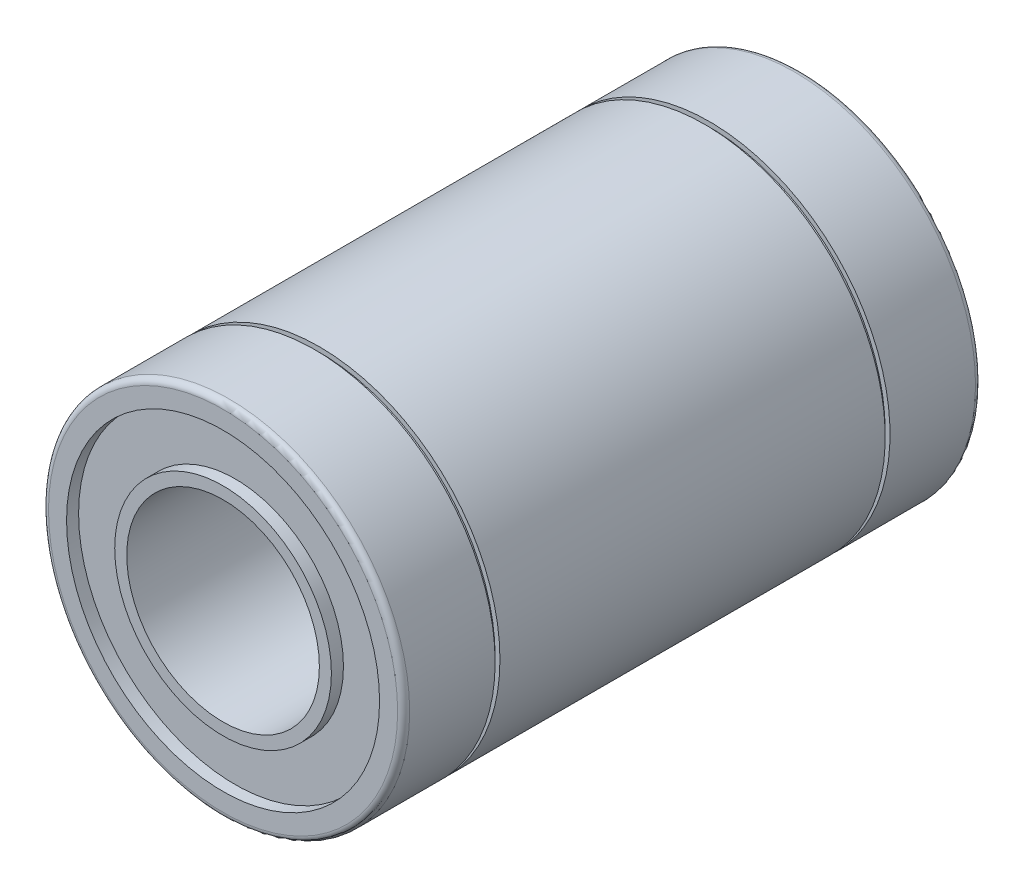
ISO-10303-21;
HEADER;
FILE_DESCRIPTION(('STEP AP214'),'2;1');
FILE_NAME('part.step','',(''),(''),'','','');
FILE_SCHEMA(('AUTOMOTIVE_DESIGN { 1 0 10303 214 1 1 1 1 }'));
ENDSEC;
DATA;
#1=APPLICATION_CONTEXT('core data for automotive mechanical design processes');
#2=APPLICATION_PROTOCOL_DEFINITION('international standard','automotive_design',2000,#1);
#3=PRODUCT_CONTEXT('',#1,'mechanical');
#4=PRODUCT('Part','Part','',(#3));
#5=PRODUCT_RELATED_PRODUCT_CATEGORY('part','',(#4));
#6=PRODUCT_DEFINITION_FORMATION('','',#4);
#7=PRODUCT_DEFINITION_CONTEXT('part definition',#1,'design');
#8=PRODUCT_DEFINITION('design','',#6,#7);
#9=PRODUCT_DEFINITION_SHAPE('','',#8);
#10=(LENGTH_UNIT() NAMED_UNIT(*) SI_UNIT(.MILLI.,.METRE.));
#11=(NAMED_UNIT(*) PLANE_ANGLE_UNIT() SI_UNIT($,.RADIAN.));
#12=(NAMED_UNIT(*) SI_UNIT($,.STERADIAN.) SOLID_ANGLE_UNIT());
#13=UNCERTAINTY_MEASURE_WITH_UNIT(LENGTH_MEASURE(1.E-05),#10,'distance_accuracy_value','');
#14=(GEOMETRIC_REPRESENTATION_CONTEXT(3) GLOBAL_UNCERTAINTY_ASSIGNED_CONTEXT((#13)) GLOBAL_UNIT_ASSIGNED_CONTEXT((#10,
#11,#12)) REPRESENTATION_CONTEXT('',''));
#15=CARTESIAN_POINT('',(0.,0.,0.));
#16=DIRECTION('',(0.,0.,1.));
#17=DIRECTION('',(1.,0.,0.));
#18=AXIS2_PLACEMENT_3D('',#15,#16,#17);
#19=CARTESIAN_POINT('',(0.,0.,12.));
#20=DIRECTION('',(0.,0.,-1.));
#21=DIRECTION('',(-1.,0.,0.));
#22=AXIS2_PLACEMENT_3D('',#19,#20,#21);
#23=CYLINDRICAL_SURFACE('',#22,7.5);
#24=CARTESIAN_POINT('',(0.,0.,8.));
#25=DIRECTION('',(0.,0.,1.));
#26=DIRECTION('',(1.,0.,0.));
#27=AXIS2_PLACEMENT_3D('',#24,#25,#26);
#28=CIRCLE('',#27,7.5);
#29=CARTESIAN_POINT('',(7.5,0.,8.));
#30=VERTEX_POINT('',#29);
#31=EDGE_CURVE('E76',#30,#30,#28,.T.);
#32=ORIENTED_EDGE('',*,*,#31,.F.);
#33=EDGE_LOOP('',(#32));
#34=FACE_BOUND('',#33,.T.);
#35=CARTESIAN_POINT('',(0.,0.,-8.));
#36=DIRECTION('',(0.,0.,-1.));
#37=DIRECTION('',(-1.,0.,0.));
#38=AXIS2_PLACEMENT_3D('',#35,#36,#37);
#39=CIRCLE('',#38,7.5);
#40=CARTESIAN_POINT('',(-7.5,0.,-8.));
#41=VERTEX_POINT('',#40);
#42=EDGE_CURVE('E68',#41,#41,#39,.T.);
#43=ORIENTED_EDGE('',*,*,#42,.F.);
#44=EDGE_LOOP('',(#43));
#45=FACE_BOUND('',#44,.T.);
#46=ADVANCED_FACE('F43',(#34,#45),#23,.T.);
#47=CARTESIAN_POINT('',(0.,0.,-11.75));
#48=DIRECTION('',(0.,0.,1.));
#49=DIRECTION('',(1.,0.,0.));
#50=AXIS2_PLACEMENT_3D('',#47,#48,#49);
#51=CIRCLE('',#50,7.5);
#52=CARTESIAN_POINT('',(7.5,0.,-11.75));
#53=VERTEX_POINT('',#52);
#54=EDGE_CURVE('E58',#53,#53,#51,.T.);
#55=ORIENTED_EDGE('',*,*,#54,.T.);
#56=EDGE_LOOP('',(#55));
#57=FACE_BOUND('',#56,.T.);
#58=CARTESIAN_POINT('',(0.,0.,-8.2));
#59=DIRECTION('',(0.,0.,-1.));
#60=DIRECTION('',(-1.,0.,0.));
#61=AXIS2_PLACEMENT_3D('',#58,#59,#60);
#62=CIRCLE('',#61,7.5);
#63=CARTESIAN_POINT('',(-7.5,0.,-8.2));
#64=VERTEX_POINT('',#63);
#65=EDGE_CURVE('E64',#64,#64,#62,.T.);
#66=ORIENTED_EDGE('',*,*,#65,.T.);
#67=EDGE_LOOP('',(#66));
#68=FACE_BOUND('',#67,.T.);
#69=ADVANCED_FACE('F129',(#57,#68),#23,.T.);
#70=CARTESIAN_POINT('',(0.,0.,-12.));
#71=DIRECTION('',(0.,0.,1.));
#72=DIRECTION('',(1.,0.,0.));
#73=AXIS2_PLACEMENT_3D('',#70,#71,#72);
#74=PLANE('',#73);
#75=CARTESIAN_POINT('',(0.,0.,-12.));
#76=DIRECTION('',(0.,0.,1.));
#77=DIRECTION('',(1.,0.,0.));
#78=AXIS2_PLACEMENT_3D('',#75,#76,#77);
#79=CIRCLE('',#78,4.);
#80=CARTESIAN_POINT('',(4.,0.,-12.));
#81=VERTEX_POINT('',#80);
#82=EDGE_CURVE('E80',#81,#81,#79,.T.);
#83=ORIENTED_EDGE('',*,*,#82,.T.);
#84=EDGE_LOOP('',(#83));
#85=FACE_BOUND('',#84,.T.);
#86=CARTESIAN_POINT('',(0.,0.,-12.));
#87=DIRECTION('',(0.,0.,-1.));
#88=DIRECTION('',(-1.,0.,0.));
#89=AXIS2_PLACEMENT_3D('',#86,#87,#88);
#90=CIRCLE('',#89,4.5);
#91=CARTESIAN_POINT('',(-4.5,0.,-12.));
#92=VERTEX_POINT('',#91);
#93=EDGE_CURVE('E75',#92,#92,#90,.T.);
#94=ORIENTED_EDGE('',*,*,#93,.T.);
#95=EDGE_LOOP('',(#94));
#96=FACE_BOUND('',#95,.T.);
#97=ADVANCED_FACE('F131',(#85,#96),#74,.F.);
#98=CARTESIAN_POINT('',(0.,0.,12.));
#99=DIRECTION('',(0.,0.,1.));
#100=DIRECTION('',(1.,0.,0.));
#101=AXIS2_PLACEMENT_3D('',#98,#99,#100);
#102=PLANE('',#101);
#103=CARTESIAN_POINT('',(0.,0.,12.));
#104=DIRECTION('',(0.,0.,1.));
#105=DIRECTION('',(1.,0.,0.));
#106=AXIS2_PLACEMENT_3D('',#103,#104,#105);
#107=CIRCLE('',#106,4.);
#108=CARTESIAN_POINT('',(4.,0.,12.));
#109=VERTEX_POINT('',#108);
#110=EDGE_CURVE('E63',#109,#109,#107,.T.);
#111=ORIENTED_EDGE('',*,*,#110,.F.);
#112=EDGE_LOOP('',(#111));
#113=FACE_BOUND('',#112,.T.);
#114=CARTESIAN_POINT('',(0.,0.,12.));
#115=DIRECTION('',(0.,0.,1.));
#116=DIRECTION('',(1.,0.,0.));
#117=AXIS2_PLACEMENT_3D('',#114,#115,#116);
#118=CIRCLE('',#117,4.5);
#119=CARTESIAN_POINT('',(4.5,0.,12.));
#120=VERTEX_POINT('',#119);
#121=EDGE_CURVE('E92',#120,#120,#118,.T.);
#122=ORIENTED_EDGE('',*,*,#121,.T.);
#123=EDGE_LOOP('',(#122));
#124=FACE_BOUND('',#123,.T.);
#125=ADVANCED_FACE('F139',(#113,#124),#102,.T.);
#126=CARTESIAN_POINT('',(0.,0.,12.));
#127=DIRECTION('',(0.,0.,1.));
#128=DIRECTION('',(1.,0.,0.));
#129=AXIS2_PLACEMENT_3D('',#126,#127,#128);
#130=CIRCLE('',#129,7.25);
#131=CARTESIAN_POINT('',(7.25,0.,12.));
#132=VERTEX_POINT('',#131);
#133=EDGE_CURVE('E50',#132,#132,#130,.T.);
#134=ORIENTED_EDGE('',*,*,#133,.T.);
#135=EDGE_LOOP('',(#134));
#136=FACE_BOUND('',#135,.T.);
#137=CARTESIAN_POINT('',(0.,0.,12.));
#138=DIRECTION('',(0.,0.,1.));
#139=DIRECTION('',(1.,0.,0.));
#140=AXIS2_PLACEMENT_3D('',#137,#138,#139);
#141=CIRCLE('',#140,6.5);
#142=CARTESIAN_POINT('',(6.5,0.,12.));
#143=VERTEX_POINT('',#142);
#144=EDGE_CURVE('E86',#143,#143,#141,.T.);
#145=ORIENTED_EDGE('',*,*,#144,.F.);
#146=EDGE_LOOP('',(#145));
#147=FACE_BOUND('',#146,.T.);
#148=ADVANCED_FACE('F153',(#136,#147),#102,.T.);
#149=CARTESIAN_POINT('',(0.,0.,-12.));
#150=DIRECTION('',(0.,0.,1.));
#151=DIRECTION('',(1.,0.,0.));
#152=AXIS2_PLACEMENT_3D('',#149,#150,#151);
#153=CIRCLE('',#152,7.25);
#154=CARTESIAN_POINT('',(7.25,0.,-12.));
#155=VERTEX_POINT('',#154);
#156=EDGE_CURVE('E54',#155,#155,#153,.F.);
#157=ORIENTED_EDGE('',*,*,#156,.T.);
#158=EDGE_LOOP('',(#157));
#159=FACE_BOUND('',#158,.T.);
#160=CARTESIAN_POINT('',(0.,0.,-12.));
#161=DIRECTION('',(0.,0.,-1.));
#162=DIRECTION('',(-1.,0.,0.));
#163=AXIS2_PLACEMENT_3D('',#160,#161,#162);
#164=CIRCLE('',#163,6.5);
#165=CARTESIAN_POINT('',(-6.5,0.,-12.));
#166=VERTEX_POINT('',#165);
#167=EDGE_CURVE('E98',#166,#166,#164,.T.);
#168=ORIENTED_EDGE('',*,*,#167,.F.);
#169=EDGE_LOOP('',(#168));
#170=FACE_BOUND('',#169,.T.);
#171=ADVANCED_FACE('F142',(#159,#170),#74,.F.);
#172=CARTESIAN_POINT('',(0.,0.,11.75));
#173=DIRECTION('',(0.,0.,1.));
#174=DIRECTION('',(1.,0.,0.));
#175=AXIS2_PLACEMENT_3D('',#172,#173,#174);
#176=CIRCLE('',#175,7.5);
#177=CARTESIAN_POINT('',(7.5,0.,11.75));
#178=VERTEX_POINT('',#177);
#179=EDGE_CURVE('E10',#178,#178,#176,.F.);
#180=ORIENTED_EDGE('',*,*,#179,.T.);
#181=EDGE_LOOP('',(#180));
#182=FACE_BOUND('',#181,.T.);
#183=CARTESIAN_POINT('',(0.,0.,8.2));
#184=DIRECTION('',(0.,0.,1.));
#185=DIRECTION('',(1.,0.,0.));
#186=AXIS2_PLACEMENT_3D('',#183,#184,#185);
#187=CIRCLE('',#186,7.5);
#188=CARTESIAN_POINT('',(7.5,0.,8.2));
#189=VERTEX_POINT('',#188);
#190=EDGE_CURVE('E72',#189,#189,#187,.T.);
#191=ORIENTED_EDGE('',*,*,#190,.T.);
#192=EDGE_LOOP('',(#191));
#193=FACE_BOUND('',#192,.T.);
#194=ADVANCED_FACE('F134',(#182,#193),#23,.T.);
#195=CARTESIAN_POINT('',(0.,0.,12.));
#196=DIRECTION('',(0.,0.,-1.));
#197=DIRECTION('',(-1.,0.,0.));
#198=AXIS2_PLACEMENT_3D('',#195,#196,#197);
#199=CYLINDRICAL_SURFACE('',#198,4.);
#200=ORIENTED_EDGE('',*,*,#110,.T.);
#201=EDGE_LOOP('',(#200));
#202=FACE_BOUND('',#201,.T.);
#203=ORIENTED_EDGE('',*,*,#82,.F.);
#204=EDGE_LOOP('',(#203));
#205=FACE_BOUND('',#204,.T.);
#206=ADVANCED_FACE('F145',(#202,#205),#199,.F.);
#207=CARTESIAN_POINT('',(0.,0.,11.5));
#208=DIRECTION('',(0.,0.,1.));
#209=DIRECTION('',(1.,0.,0.));
#210=AXIS2_PLACEMENT_3D('',#207,#208,#209);
#211=CYLINDRICAL_SURFACE('',#210,6.5);
#212=CARTESIAN_POINT('',(0.,0.,11.5));
#213=DIRECTION('',(0.,0.,1.));
#214=DIRECTION('',(1.,0.,0.));
#215=AXIS2_PLACEMENT_3D('',#212,#213,#214);
#216=CIRCLE('',#215,6.5);
#217=CARTESIAN_POINT('',(6.5,0.,11.5));
#218=VERTEX_POINT('',#217);
#219=EDGE_CURVE('E83',#218,#218,#216,.T.);
#220=ORIENTED_EDGE('',*,*,#219,.F.);
#221=EDGE_LOOP('',(#220));
#222=FACE_BOUND('',#221,.T.);
#223=ORIENTED_EDGE('',*,*,#144,.T.);
#224=EDGE_LOOP('',(#223));
#225=FACE_BOUND('',#224,.T.);
#226=ADVANCED_FACE('F150',(#222,#225),#211,.F.);
#227=CARTESIAN_POINT('',(0.,0.,11.5));
#228=DIRECTION('',(0.,0.,1.));
#229=DIRECTION('',(1.,0.,0.));
#230=AXIS2_PLACEMENT_3D('',#227,#228,#229);
#231=PLANE('',#230);
#232=CARTESIAN_POINT('',(0.,0.,11.5));
#233=DIRECTION('',(0.,0.,1.));
#234=DIRECTION('',(1.,0.,0.));
#235=AXIS2_PLACEMENT_3D('',#232,#233,#234);
#236=CIRCLE('',#235,4.5);
#237=CARTESIAN_POINT('',(4.5,0.,11.5));
#238=VERTEX_POINT('',#237);
#239=EDGE_CURVE('E89',#238,#238,#236,.T.);
#240=ORIENTED_EDGE('',*,*,#239,.F.);
#241=EDGE_LOOP('',(#240));
#242=FACE_BOUND('',#241,.T.);
#243=ORIENTED_EDGE('',*,*,#219,.T.);
#244=EDGE_LOOP('',(#243));
#245=FACE_BOUND('',#244,.T.);
#246=ADVANCED_FACE('F186',(#242,#245),#231,.T.);
#247=CARTESIAN_POINT('',(0.,0.,11.5));
#248=DIRECTION('',(0.,0.,1.));
#249=DIRECTION('',(1.,0.,0.));
#250=AXIS2_PLACEMENT_3D('',#247,#248,#249);
#251=CYLINDRICAL_SURFACE('',#250,4.5);
#252=ORIENTED_EDGE('',*,*,#239,.T.);
#253=EDGE_LOOP('',(#252));
#254=FACE_BOUND('',#253,.T.);
#255=ORIENTED_EDGE('',*,*,#121,.F.);
#256=EDGE_LOOP('',(#255));
#257=FACE_BOUND('',#256,.T.);
#258=ADVANCED_FACE('F182',(#254,#257),#251,.T.);
#259=CARTESIAN_POINT('',(0.,0.,-11.5));
#260=DIRECTION('',(0.,0.,-1.));
#261=DIRECTION('',(-1.,0.,0.));
#262=AXIS2_PLACEMENT_3D('',#259,#260,#261);
#263=CYLINDRICAL_SURFACE('',#262,6.5);
#264=CARTESIAN_POINT('',(0.,0.,-11.5));
#265=DIRECTION('',(0.,0.,-1.));
#266=DIRECTION('',(-1.,0.,0.));
#267=AXIS2_PLACEMENT_3D('',#264,#265,#266);
#268=CIRCLE('',#267,6.5);
#269=CARTESIAN_POINT('',(-6.5,0.,-11.5));
#270=VERTEX_POINT('',#269);
#271=EDGE_CURVE('E95',#270,#270,#268,.T.);
#272=ORIENTED_EDGE('',*,*,#271,.F.);
#273=EDGE_LOOP('',(#272));
#274=FACE_BOUND('',#273,.T.);
#275=ORIENTED_EDGE('',*,*,#167,.T.);
#276=EDGE_LOOP('',(#275));
#277=FACE_BOUND('',#276,.T.);
#278=ADVANCED_FACE('F178',(#274,#277),#263,.F.);
#279=CARTESIAN_POINT('',(0.,0.,-11.5));
#280=DIRECTION('',(0.,0.,-1.));
#281=DIRECTION('',(-1.,0.,0.));
#282=AXIS2_PLACEMENT_3D('',#279,#280,#281);
#283=PLANE('',#282);
#284=CARTESIAN_POINT('',(0.,0.,-11.5));
#285=DIRECTION('',(0.,0.,-1.));
#286=DIRECTION('',(-1.,0.,0.));
#287=AXIS2_PLACEMENT_3D('',#284,#285,#286);
#288=CIRCLE('',#287,4.5);
#289=CARTESIAN_POINT('',(-4.5,0.,-11.5));
#290=VERTEX_POINT('',#289);
#291=EDGE_CURVE('E101',#290,#290,#288,.T.);
#292=ORIENTED_EDGE('',*,*,#291,.F.);
#293=EDGE_LOOP('',(#292));
#294=FACE_BOUND('',#293,.T.);
#295=ORIENTED_EDGE('',*,*,#271,.T.);
#296=EDGE_LOOP('',(#295));
#297=FACE_BOUND('',#296,.T.);
#298=ADVANCED_FACE('F170',(#294,#297),#283,.T.);
#299=CARTESIAN_POINT('',(0.,0.,-11.5));
#300=DIRECTION('',(0.,0.,-1.));
#301=DIRECTION('',(-1.,0.,0.));
#302=AXIS2_PLACEMENT_3D('',#299,#300,#301);
#303=CYLINDRICAL_SURFACE('',#302,4.5);
#304=ORIENTED_EDGE('',*,*,#291,.T.);
#305=EDGE_LOOP('',(#304));
#306=FACE_BOUND('',#305,.T.);
#307=ORIENTED_EDGE('',*,*,#93,.F.);
#308=EDGE_LOOP('',(#307));
#309=FACE_BOUND('',#308,.T.);
#310=ADVANCED_FACE('F161',(#306,#309),#303,.T.);
#311=CARTESIAN_POINT('',(0.,0.,8.2));
#312=DIRECTION('',(0.,0.,1.));
#313=DIRECTION('',(1.,0.,0.));
#314=AXIS2_PLACEMENT_3D('',#311,#312,#313);
#315=PLANE('',#314);
#316=CARTESIAN_POINT('',(0.,0.,8.2));
#317=DIRECTION('',(0.,0.,1.));
#318=DIRECTION('',(1.,0.,0.));
#319=AXIS2_PLACEMENT_3D('',#316,#317,#318);
#320=CIRCLE('',#319,7.3);
#321=CARTESIAN_POINT('',(7.3,0.,8.2));
#322=VERTEX_POINT('',#321);
#323=EDGE_CURVE('E79',#322,#322,#320,.T.);
#324=ORIENTED_EDGE('',*,*,#323,.T.);
#325=EDGE_LOOP('',(#324));
#326=FACE_BOUND('',#325,.T.);
#327=ORIENTED_EDGE('',*,*,#190,.F.);
#328=EDGE_LOOP('',(#327));
#329=FACE_BOUND('',#328,.T.);
#330=ADVANCED_FACE('F158',(#326,#329),#315,.F.);
#331=CARTESIAN_POINT('',(0.,0.,8.));
#332=DIRECTION('',(0.,0.,1.));
#333=DIRECTION('',(1.,0.,0.));
#334=AXIS2_PLACEMENT_3D('',#331,#332,#333);
#335=PLANE('',#334);
#336=CARTESIAN_POINT('',(0.,0.,8.));
#337=DIRECTION('',(0.,0.,1.));
#338=DIRECTION('',(1.,0.,0.));
#339=AXIS2_PLACEMENT_3D('',#336,#337,#338);
#340=CIRCLE('',#339,7.3);
#341=CARTESIAN_POINT('',(7.3,0.,8.));
#342=VERTEX_POINT('',#341);
#343=EDGE_CURVE('E67',#342,#342,#340,.T.);
#344=ORIENTED_EDGE('',*,*,#343,.F.);
#345=EDGE_LOOP('',(#344));
#346=FACE_BOUND('',#345,.T.);
#347=ORIENTED_EDGE('',*,*,#31,.T.);
#348=EDGE_LOOP('',(#347));
#349=FACE_BOUND('',#348,.T.);
#350=ADVANCED_FACE('F160',(#346,#349),#335,.T.);
#351=CARTESIAN_POINT('',(0.,0.,8.2));
#352=DIRECTION('',(0.,0.,-1.));
#353=DIRECTION('',(-1.,0.,0.));
#354=AXIS2_PLACEMENT_3D('',#351,#352,#353);
#355=CYLINDRICAL_SURFACE('',#354,7.3);
#356=ORIENTED_EDGE('',*,*,#323,.F.);
#357=EDGE_LOOP('',(#356));
#358=FACE_BOUND('',#357,.T.);
#359=ORIENTED_EDGE('',*,*,#343,.T.);
#360=EDGE_LOOP('',(#359));
#361=FACE_BOUND('',#360,.T.);
#362=ADVANCED_FACE('F125',(#358,#361),#355,.T.);
#363=CARTESIAN_POINT('',(0.,0.,-8.2));
#364=DIRECTION('',(0.,0.,-1.));
#365=DIRECTION('',(1.,0.,0.));
#366=AXIS2_PLACEMENT_3D('',#363,#364,#365);
#367=PLANE('',#366);
#368=CARTESIAN_POINT('',(0.,0.,-8.2));
#369=DIRECTION('',(0.,0.,1.));
#370=DIRECTION('',(1.,0.,0.));
#371=AXIS2_PLACEMENT_3D('',#368,#369,#370);
#372=CIRCLE('',#371,7.3);
#373=CARTESIAN_POINT('',(7.3,0.,-8.2));
#374=VERTEX_POINT('',#373);
#375=EDGE_CURVE('E71',#374,#374,#372,.T.);
#376=ORIENTED_EDGE('',*,*,#375,.F.);
#377=EDGE_LOOP('',(#376));
#378=FACE_BOUND('',#377,.T.);
#379=ORIENTED_EDGE('',*,*,#65,.F.);
#380=EDGE_LOOP('',(#379));
#381=FACE_BOUND('',#380,.T.);
#382=ADVANCED_FACE('F121',(#378,#381),#367,.F.);
#383=CARTESIAN_POINT('',(0.,0.,-8.));
#384=DIRECTION('',(0.,0.,-1.));
#385=DIRECTION('',(1.,0.,0.));
#386=AXIS2_PLACEMENT_3D('',#383,#384,#385);
#387=PLANE('',#386);
#388=CARTESIAN_POINT('',(0.,0.,-8.));
#389=DIRECTION('',(0.,0.,1.));
#390=DIRECTION('',(1.,0.,0.));
#391=AXIS2_PLACEMENT_3D('',#388,#389,#390);
#392=CIRCLE('',#391,7.3);
#393=CARTESIAN_POINT('',(7.3,0.,-8.));
#394=VERTEX_POINT('',#393);
#395=EDGE_CURVE('E112',#394,#394,#392,.T.);
#396=ORIENTED_EDGE('',*,*,#395,.T.);
#397=EDGE_LOOP('',(#396));
#398=FACE_BOUND('',#397,.T.);
#399=ORIENTED_EDGE('',*,*,#42,.T.);
#400=EDGE_LOOP('',(#399));
#401=FACE_BOUND('',#400,.T.);
#402=ADVANCED_FACE('F124',(#398,#401),#387,.T.);
#403=CARTESIAN_POINT('',(0.,0.,-8.2));
#404=DIRECTION('',(0.,0.,1.));
#405=DIRECTION('',(1.,0.,0.));
#406=AXIS2_PLACEMENT_3D('',#403,#404,#405);
#407=CYLINDRICAL_SURFACE('',#406,7.3);
#408=ORIENTED_EDGE('',*,*,#375,.T.);
#409=EDGE_LOOP('',(#408));
#410=FACE_BOUND('',#409,.T.);
#411=ORIENTED_EDGE('',*,*,#395,.F.);
#412=EDGE_LOOP('',(#411));
#413=FACE_BOUND('',#412,.T.);
#414=ADVANCED_FACE('F118',(#410,#413),#407,.T.);
#415=CARTESIAN_POINT('',(0.,0.,-11.75));
#416=DIRECTION('',(0.,0.,1.));
#417=DIRECTION('',(1.,0.,0.));
#418=AXIS2_PLACEMENT_3D('',#415,#416,#417);
#419=TOROIDAL_SURFACE('',#418,7.25,0.25);
#420=ORIENTED_EDGE('',*,*,#156,.F.);
#421=EDGE_LOOP('',(#420));
#422=FACE_BOUND('',#421,.T.);
#423=ORIENTED_EDGE('',*,*,#54,.F.);
#424=EDGE_LOOP('',(#423));
#425=FACE_BOUND('',#424,.T.);
#426=ADVANCED_FACE('F265',(#422,#425),#419,.T.);
#427=CARTESIAN_POINT('',(0.,0.,11.75));
#428=DIRECTION('',(0.,0.,1.));
#429=DIRECTION('',(1.,0.,0.));
#430=AXIS2_PLACEMENT_3D('',#427,#428,#429);
#431=TOROIDAL_SURFACE('',#430,7.25,0.25);
#432=ORIENTED_EDGE('',*,*,#179,.F.);
#433=EDGE_LOOP('',(#432));
#434=FACE_BOUND('',#433,.T.);
#435=ORIENTED_EDGE('',*,*,#133,.F.);
#436=EDGE_LOOP('',(#435));
#437=FACE_BOUND('',#436,.T.);
#438=ADVANCED_FACE('F45',(#434,#437),#431,.T.);
#439=CLOSED_SHELL('',(#46,#69,#97,#125,#148,#171,#194,#206,#226,#246,#258,#278,#298,#310,#330,
#350,#362,#382,#402,#414,#426,#438));
#440=MANIFOLD_SOLID_BREP('B2',#439);
#441=ADVANCED_BREP_SHAPE_REPRESENTATION('',(#18,#440),#14);
#442=SHAPE_DEFINITION_REPRESENTATION(#9,#441);
ENDSEC;
END-ISO-10303-21;
